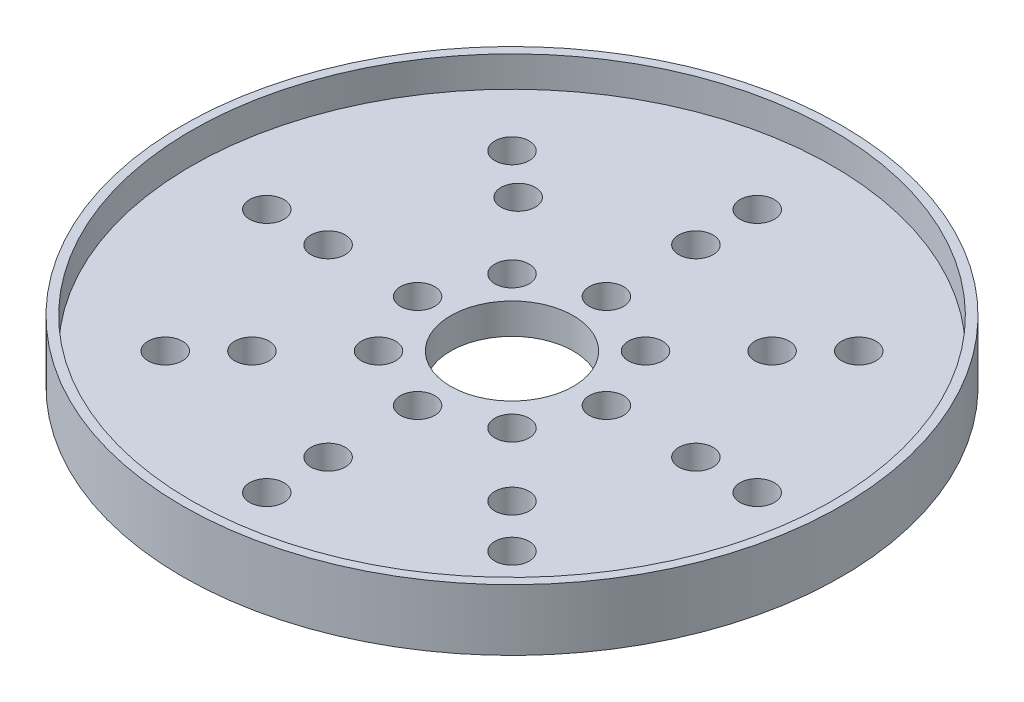
ISO-10303-21;
HEADER;
FILE_DESCRIPTION(('STEP AP214'),'2;1');
FILE_NAME('part.step','',(''),(''),'','','');
FILE_SCHEMA(('AUTOMOTIVE_DESIGN { 1 0 10303 214 1 1 1 1 }'));
ENDSEC;
DATA;
#1=APPLICATION_CONTEXT('core data for automotive mechanical design processes');
#2=APPLICATION_PROTOCOL_DEFINITION('international standard','automotive_design',2000,#1);
#3=PRODUCT_CONTEXT('',#1,'mechanical');
#4=PRODUCT('Part','Part','',(#3));
#5=PRODUCT_RELATED_PRODUCT_CATEGORY('part','',(#4));
#6=PRODUCT_DEFINITION_FORMATION('','',#4);
#7=PRODUCT_DEFINITION_CONTEXT('part definition',#1,'design');
#8=PRODUCT_DEFINITION('design','',#6,#7);
#9=PRODUCT_DEFINITION_SHAPE('','',#8);
#10=(LENGTH_UNIT() NAMED_UNIT(*) SI_UNIT(.MILLI.,.METRE.));
#11=(NAMED_UNIT(*) PLANE_ANGLE_UNIT() SI_UNIT($,.RADIAN.));
#12=(NAMED_UNIT(*) SI_UNIT($,.STERADIAN.) SOLID_ANGLE_UNIT());
#13=UNCERTAINTY_MEASURE_WITH_UNIT(LENGTH_MEASURE(1.E-05),#10,'distance_accuracy_value','');
#14=(GEOMETRIC_REPRESENTATION_CONTEXT(3) GLOBAL_UNCERTAINTY_ASSIGNED_CONTEXT((#13)) GLOBAL_UNIT_ASSIGNED_CONTEXT((#10,
#11,#12)) REPRESENTATION_CONTEXT('',''));
#15=CARTESIAN_POINT('',(0.,0.,0.));
#16=DIRECTION('',(0.,0.,1.));
#17=DIRECTION('',(1.,0.,0.));
#18=AXIS2_PLACEMENT_3D('',#15,#16,#17);
#19=CARTESIAN_POINT('',(0.,6.35,0.));
#20=DIRECTION('',(0.,-1.,0.));
#21=DIRECTION('',(0.,0.,-1.));
#22=AXIS2_PLACEMENT_3D('',#19,#20,#21);
#23=CYLINDRICAL_SURFACE('',#22,34.1376);
#24=CARTESIAN_POINT('',(0.,6.35,0.));
#25=DIRECTION('',(0.,1.,0.));
#26=DIRECTION('',(0.,0.,1.));
#27=AXIS2_PLACEMENT_3D('',#24,#25,#26);
#28=CIRCLE('',#27,34.1376);
#29=CARTESIAN_POINT('',(0.,6.35,34.1376));
#30=VERTEX_POINT('',#29);
#31=EDGE_CURVE('E10',#30,#30,#28,.T.);
#32=ORIENTED_EDGE('',*,*,#31,.F.);
#33=EDGE_LOOP('',(#32));
#34=FACE_BOUND('',#33,.T.);
#35=CARTESIAN_POINT('',(0.,0.,0.));
#36=DIRECTION('',(0.,1.,0.));
#37=DIRECTION('',(0.,0.,1.));
#38=AXIS2_PLACEMENT_3D('',#35,#36,#37);
#39=CIRCLE('',#38,34.1376);
#40=CARTESIAN_POINT('',(0.,0.,34.1376));
#41=VERTEX_POINT('',#40);
#42=EDGE_CURVE('E34',#41,#41,#39,.T.);
#43=ORIENTED_EDGE('',*,*,#42,.T.);
#44=EDGE_LOOP('',(#43));
#45=FACE_BOUND('',#44,.T.);
#46=ADVANCED_FACE('F31',(#34,#45),#23,.T.);
#47=CARTESIAN_POINT('',(0.,6.35,0.));
#48=DIRECTION('',(0.,1.,0.));
#49=DIRECTION('',(0.,0.,1.));
#50=AXIS2_PLACEMENT_3D('',#47,#48,#49);
#51=PLANE('',#50);
#52=CARTESIAN_POINT('',(0.,6.35,0.));
#53=DIRECTION('',(0.,1.,0.));
#54=DIRECTION('',(0.,0.,1.));
#55=AXIS2_PLACEMENT_3D('',#52,#53,#54);
#56=CIRCLE('',#55,33.2105);
#57=CARTESIAN_POINT('',(0.,6.35,33.2105));
#58=VERTEX_POINT('',#57);
#59=EDGE_CURVE('E43',#58,#58,#56,.T.);
#60=ORIENTED_EDGE('',*,*,#59,.F.);
#61=EDGE_LOOP('',(#60));
#62=FACE_BOUND('',#61,.T.);
#63=ORIENTED_EDGE('',*,*,#31,.T.);
#64=EDGE_LOOP('',(#63));
#65=FACE_BOUND('',#64,.T.);
#66=ADVANCED_FACE('F270',(#62,#65),#51,.T.);
#67=CARTESIAN_POINT('',(0.,0.,0.));
#68=DIRECTION('',(0.,1.,0.));
#69=DIRECTION('',(0.,0.,1.));
#70=AXIS2_PLACEMENT_3D('',#67,#68,#69);
#71=PLANE('',#70);
#72=CARTESIAN_POINT('',(6.91479721322325,0.,6.91479721322325));
#73=DIRECTION('',(0.,1.,0.));
#74=DIRECTION('',(0.,0.,1.));
#75=AXIS2_PLACEMENT_3D('',#72,#73,#74);
#76=CIRCLE('',#75,1.778);
#77=CARTESIAN_POINT('',(6.91479721322325,0.,8.69279721322325));
#78=VERTEX_POINT('',#77);
#79=EDGE_CURVE('E190',#78,#78,#76,.T.);
#80=ORIENTED_EDGE('',*,*,#79,.T.);
#81=EDGE_LOOP('',(#80));
#82=FACE_BOUND('',#81,.T.);
#83=CARTESIAN_POINT('',(0.,0.,9.779));
#84=DIRECTION('',(0.,1.,0.));
#85=DIRECTION('',(0.,0.,1.));
#86=AXIS2_PLACEMENT_3D('',#83,#84,#85);
#87=CIRCLE('',#86,1.778);
#88=CARTESIAN_POINT('',(0.,0.,11.557));
#89=VERTEX_POINT('',#88);
#90=EDGE_CURVE('E184',#89,#89,#87,.T.);
#91=ORIENTED_EDGE('',*,*,#90,.T.);
#92=EDGE_LOOP('',(#91));
#93=FACE_BOUND('',#92,.T.);
#94=CARTESIAN_POINT('',(-6.91479721322325,0.,6.91479721322325));
#95=DIRECTION('',(0.,1.,0.));
#96=DIRECTION('',(0.,0.,1.));
#97=AXIS2_PLACEMENT_3D('',#94,#95,#96);
#98=CIRCLE('',#97,1.778);
#99=CARTESIAN_POINT('',(-6.91479721322325,0.,8.69279721322325));
#100=VERTEX_POINT('',#99);
#101=EDGE_CURVE('E178',#100,#100,#98,.T.);
#102=ORIENTED_EDGE('',*,*,#101,.T.);
#103=EDGE_LOOP('',(#102));
#104=FACE_BOUND('',#103,.T.);
#105=CARTESIAN_POINT('',(-9.779,0.,0.));
#106=DIRECTION('',(0.,1.,0.));
#107=DIRECTION('',(0.,0.,1.));
#108=AXIS2_PLACEMENT_3D('',#105,#106,#107);
#109=CIRCLE('',#108,1.778);
#110=CARTESIAN_POINT('',(-9.779,0.,1.778));
#111=VERTEX_POINT('',#110);
#112=EDGE_CURVE('E172',#111,#111,#109,.T.);
#113=ORIENTED_EDGE('',*,*,#112,.T.);
#114=EDGE_LOOP('',(#113));
#115=FACE_BOUND('',#114,.T.);
#116=CARTESIAN_POINT('',(-6.91479721322325,0.,-6.91479721322325));
#117=DIRECTION('',(0.,1.,0.));
#118=DIRECTION('',(0.,0.,1.));
#119=AXIS2_PLACEMENT_3D('',#116,#117,#118);
#120=CIRCLE('',#119,1.778);
#121=CARTESIAN_POINT('',(-6.91479721322325,0.,-5.13679721322325));
#122=VERTEX_POINT('',#121);
#123=EDGE_CURVE('E166',#122,#122,#120,.T.);
#124=ORIENTED_EDGE('',*,*,#123,.T.);
#125=EDGE_LOOP('',(#124));
#126=FACE_BOUND('',#125,.T.);
#127=CARTESIAN_POINT('',(0.,0.,-9.779));
#128=DIRECTION('',(0.,1.,0.));
#129=DIRECTION('',(0.,0.,1.));
#130=AXIS2_PLACEMENT_3D('',#127,#128,#129);
#131=CIRCLE('',#130,1.778);
#132=CARTESIAN_POINT('',(0.,0.,-8.001));
#133=VERTEX_POINT('',#132);
#134=EDGE_CURVE('E160',#133,#133,#131,.T.);
#135=ORIENTED_EDGE('',*,*,#134,.T.);
#136=EDGE_LOOP('',(#135));
#137=FACE_BOUND('',#136,.T.);
#138=CARTESIAN_POINT('',(6.91479721322325,0.,-6.91479721322325));
#139=DIRECTION('',(0.,1.,0.));
#140=DIRECTION('',(0.,0.,1.));
#141=AXIS2_PLACEMENT_3D('',#138,#139,#140);
#142=CIRCLE('',#141,1.778);
#143=CARTESIAN_POINT('',(6.91479721322325,0.,-5.13679721322325));
#144=VERTEX_POINT('',#143);
#145=EDGE_CURVE('E154',#144,#144,#142,.T.);
#146=ORIENTED_EDGE('',*,*,#145,.T.);
#147=EDGE_LOOP('',(#146));
#148=FACE_BOUND('',#147,.T.);
#149=CARTESIAN_POINT('',(9.779,0.,0.));
#150=DIRECTION('',(0.,1.,0.));
#151=DIRECTION('',(0.,0.,1.));
#152=AXIS2_PLACEMENT_3D('',#149,#150,#151);
#153=CIRCLE('',#152,1.778);
#154=CARTESIAN_POINT('',(9.779,0.,1.778));
#155=VERTEX_POINT('',#154);
#156=EDGE_CURVE('E148',#155,#155,#153,.T.);
#157=ORIENTED_EDGE('',*,*,#156,.T.);
#158=EDGE_LOOP('',(#157));
#159=FACE_BOUND('',#158,.T.);
#160=CARTESIAN_POINT('',(13.4703841816037,0.,-13.4703841816037));
#161=DIRECTION('',(0.,1.,0.));
#162=DIRECTION('',(0.,0.,1.));
#163=AXIS2_PLACEMENT_3D('',#160,#161,#162);
#164=CIRCLE('',#163,1.778);
#165=CARTESIAN_POINT('',(13.4703841816037,0.,-11.6923841816037));
#166=VERTEX_POINT('',#165);
#167=EDGE_CURVE('E142',#166,#166,#164,.T.);
#168=ORIENTED_EDGE('',*,*,#167,.T.);
#169=EDGE_LOOP('',(#168));
#170=FACE_BOUND('',#169,.T.);
#171=CARTESIAN_POINT('',(19.05,0.,0.));
#172=DIRECTION('',(0.,1.,0.));
#173=DIRECTION('',(0.,0.,1.));
#174=AXIS2_PLACEMENT_3D('',#171,#172,#173);
#175=CIRCLE('',#174,1.778);
#176=CARTESIAN_POINT('',(19.05,0.,1.778));
#177=VERTEX_POINT('',#176);
#178=EDGE_CURVE('E136',#177,#177,#175,.T.);
#179=ORIENTED_EDGE('',*,*,#178,.T.);
#180=EDGE_LOOP('',(#179));
#181=FACE_BOUND('',#180,.T.);
#182=CARTESIAN_POINT('',(13.4703841816037,0.,13.4703841816037));
#183=DIRECTION('',(0.,1.,0.));
#184=DIRECTION('',(0.,0.,1.));
#185=AXIS2_PLACEMENT_3D('',#182,#183,#184);
#186=CIRCLE('',#185,1.778);
#187=CARTESIAN_POINT('',(13.4703841816037,0.,15.2483841816037));
#188=VERTEX_POINT('',#187);
#189=EDGE_CURVE('E130',#188,#188,#186,.T.);
#190=ORIENTED_EDGE('',*,*,#189,.T.);
#191=EDGE_LOOP('',(#190));
#192=FACE_BOUND('',#191,.T.);
#193=CARTESIAN_POINT('',(0.,0.,19.05));
#194=DIRECTION('',(0.,1.,0.));
#195=DIRECTION('',(0.,0.,1.));
#196=AXIS2_PLACEMENT_3D('',#193,#194,#195);
#197=CIRCLE('',#196,1.778);
#198=CARTESIAN_POINT('',(0.,0.,20.828));
#199=VERTEX_POINT('',#198);
#200=EDGE_CURVE('E124',#199,#199,#197,.T.);
#201=ORIENTED_EDGE('',*,*,#200,.T.);
#202=EDGE_LOOP('',(#201));
#203=FACE_BOUND('',#202,.T.);
#204=CARTESIAN_POINT('',(-13.4703841816037,0.,13.4703841816037));
#205=DIRECTION('',(0.,1.,0.));
#206=DIRECTION('',(0.,0.,1.));
#207=AXIS2_PLACEMENT_3D('',#204,#205,#206);
#208=CIRCLE('',#207,1.778);
#209=CARTESIAN_POINT('',(-13.4703841816037,0.,15.2483841816037));
#210=VERTEX_POINT('',#209);
#211=EDGE_CURVE('E118',#210,#210,#208,.T.);
#212=ORIENTED_EDGE('',*,*,#211,.T.);
#213=EDGE_LOOP('',(#212));
#214=FACE_BOUND('',#213,.T.);
#215=CARTESIAN_POINT('',(-19.05,0.,0.));
#216=DIRECTION('',(0.,1.,0.));
#217=DIRECTION('',(0.,0.,1.));
#218=AXIS2_PLACEMENT_3D('',#215,#216,#217);
#219=CIRCLE('',#218,1.778);
#220=CARTESIAN_POINT('',(-19.05,0.,1.778));
#221=VERTEX_POINT('',#220);
#222=EDGE_CURVE('E112',#221,#221,#219,.T.);
#223=ORIENTED_EDGE('',*,*,#222,.T.);
#224=EDGE_LOOP('',(#223));
#225=FACE_BOUND('',#224,.T.);
#226=CARTESIAN_POINT('',(-13.4703841816037,0.,-14.1089661095624));
#227=DIRECTION('',(0.,1.,0.));
#228=DIRECTION('',(0.,0.,1.));
#229=AXIS2_PLACEMENT_3D('',#226,#227,#228);
#230=CIRCLE('',#229,1.778);
#231=CARTESIAN_POINT('',(-13.4703841816037,0.,-12.3309661095624));
#232=VERTEX_POINT('',#231);
#233=EDGE_CURVE('E106',#232,#232,#230,.T.);
#234=ORIENTED_EDGE('',*,*,#233,.T.);
#235=EDGE_LOOP('',(#234));
#236=FACE_BOUND('',#235,.T.);
#237=CARTESIAN_POINT('',(0.,0.,-19.05));
#238=DIRECTION('',(0.,1.,0.));
#239=DIRECTION('',(0.,0.,1.));
#240=AXIS2_PLACEMENT_3D('',#237,#238,#239);
#241=CIRCLE('',#240,1.778);
#242=CARTESIAN_POINT('',(0.,0.,-17.272));
#243=VERTEX_POINT('',#242);
#244=EDGE_CURVE('E100',#243,#243,#241,.T.);
#245=ORIENTED_EDGE('',*,*,#244,.T.);
#246=EDGE_LOOP('',(#245));
#247=FACE_BOUND('',#246,.T.);
#248=CARTESIAN_POINT('',(17.9605122421383,0.,17.9605122421383));
#249=DIRECTION('',(0.,1.,0.));
#250=DIRECTION('',(0.,0.,1.));
#251=AXIS2_PLACEMENT_3D('',#248,#249,#250);
#252=CIRCLE('',#251,1.778);
#253=CARTESIAN_POINT('',(17.9605122421383,0.,19.7385122421383));
#254=VERTEX_POINT('',#253);
#255=EDGE_CURVE('E94',#254,#254,#252,.T.);
#256=ORIENTED_EDGE('',*,*,#255,.T.);
#257=EDGE_LOOP('',(#256));
#258=FACE_BOUND('',#257,.T.);
#259=CARTESIAN_POINT('',(0.,0.,25.4));
#260=DIRECTION('',(0.,1.,0.));
#261=DIRECTION('',(0.,0.,1.));
#262=AXIS2_PLACEMENT_3D('',#259,#260,#261);
#263=CIRCLE('',#262,1.778);
#264=CARTESIAN_POINT('',(0.,0.,27.178));
#265=VERTEX_POINT('',#264);
#266=EDGE_CURVE('E88',#265,#265,#263,.T.);
#267=ORIENTED_EDGE('',*,*,#266,.T.);
#268=EDGE_LOOP('',(#267));
#269=FACE_BOUND('',#268,.T.);
#270=CARTESIAN_POINT('',(-17.9605122421383,0.,17.9605122421383));
#271=DIRECTION('',(0.,1.,0.));
#272=DIRECTION('',(0.,0.,1.));
#273=AXIS2_PLACEMENT_3D('',#270,#271,#272);
#274=CIRCLE('',#273,1.778);
#275=CARTESIAN_POINT('',(-17.9605122421383,0.,19.7385122421383));
#276=VERTEX_POINT('',#275);
#277=EDGE_CURVE('E82',#276,#276,#274,.T.);
#278=ORIENTED_EDGE('',*,*,#277,.T.);
#279=EDGE_LOOP('',(#278));
#280=FACE_BOUND('',#279,.T.);
#281=CARTESIAN_POINT('',(-25.4,0.,0.));
#282=DIRECTION('',(0.,1.,0.));
#283=DIRECTION('',(0.,0.,1.));
#284=AXIS2_PLACEMENT_3D('',#281,#282,#283);
#285=CIRCLE('',#284,1.778);
#286=CARTESIAN_POINT('',(-25.4,0.,1.77800000000001));
#287=VERTEX_POINT('',#286);
#288=EDGE_CURVE('E76',#287,#287,#285,.T.);
#289=ORIENTED_EDGE('',*,*,#288,.T.);
#290=EDGE_LOOP('',(#289));
#291=FACE_BOUND('',#290,.T.);
#292=CARTESIAN_POINT('',(-17.9605122421383,0.,-17.9605122421383));
#293=DIRECTION('',(0.,1.,0.));
#294=DIRECTION('',(0.,0.,1.));
#295=AXIS2_PLACEMENT_3D('',#292,#293,#294);
#296=CIRCLE('',#295,1.778);
#297=CARTESIAN_POINT('',(-17.9605122421383,0.,-16.1825122421383));
#298=VERTEX_POINT('',#297);
#299=EDGE_CURVE('E70',#298,#298,#296,.T.);
#300=ORIENTED_EDGE('',*,*,#299,.T.);
#301=EDGE_LOOP('',(#300));
#302=FACE_BOUND('',#301,.T.);
#303=CARTESIAN_POINT('',(0.,0.,-25.4));
#304=DIRECTION('',(0.,1.,0.));
#305=DIRECTION('',(0.,0.,1.));
#306=AXIS2_PLACEMENT_3D('',#303,#304,#305);
#307=CIRCLE('',#306,1.778);
#308=CARTESIAN_POINT('',(0.,0.,-23.622));
#309=VERTEX_POINT('',#308);
#310=EDGE_CURVE('E64',#309,#309,#307,.T.);
#311=ORIENTED_EDGE('',*,*,#310,.T.);
#312=EDGE_LOOP('',(#311));
#313=FACE_BOUND('',#312,.T.);
#314=CARTESIAN_POINT('',(17.9605122421383,0.,-17.9605122421383));
#315=DIRECTION('',(0.,1.,0.));
#316=DIRECTION('',(0.,0.,1.));
#317=AXIS2_PLACEMENT_3D('',#314,#315,#316);
#318=CIRCLE('',#317,1.778);
#319=CARTESIAN_POINT('',(17.9605122421383,0.,-16.1825122421383));
#320=VERTEX_POINT('',#319);
#321=EDGE_CURVE('E58',#320,#320,#318,.T.);
#322=ORIENTED_EDGE('',*,*,#321,.T.);
#323=EDGE_LOOP('',(#322));
#324=FACE_BOUND('',#323,.T.);
#325=CARTESIAN_POINT('',(25.4,0.,0.));
#326=DIRECTION('',(0.,1.,0.));
#327=DIRECTION('',(0.,0.,1.));
#328=AXIS2_PLACEMENT_3D('',#325,#326,#327);
#329=CIRCLE('',#328,1.778);
#330=CARTESIAN_POINT('',(25.4,0.,1.778));
#331=VERTEX_POINT('',#330);
#332=EDGE_CURVE('E52',#331,#331,#329,.T.);
#333=ORIENTED_EDGE('',*,*,#332,.T.);
#334=EDGE_LOOP('',(#333));
#335=FACE_BOUND('',#334,.T.);
#336=CARTESIAN_POINT('',(0.,0.,0.));
#337=DIRECTION('',(0.,1.,0.));
#338=DIRECTION('',(0.,0.,1.));
#339=AXIS2_PLACEMENT_3D('',#336,#337,#338);
#340=CIRCLE('',#339,6.35);
#341=CARTESIAN_POINT('',(0.,0.,6.35));
#342=VERTEX_POINT('',#341);
#343=EDGE_CURVE('E46',#342,#342,#340,.T.);
#344=ORIENTED_EDGE('',*,*,#343,.T.);
#345=EDGE_LOOP('',(#344));
#346=FACE_BOUND('',#345,.T.);
#347=ORIENTED_EDGE('',*,*,#42,.F.);
#348=EDGE_LOOP('',(#347));
#349=FACE_BOUND('',#348,.T.);
#350=ADVANCED_FACE('F199',(#82,#93,#104,#115,#126,#137,#148,#159,#170,#181,#192,#203,#214,#225,
#236,#247,#258,#269,#280,#291,#302,#313,#324,#335,#346,#349),#71,.F.);
#351=CARTESIAN_POINT('',(0.,3.175,0.));
#352=DIRECTION('',(0.,1.,0.));
#353=DIRECTION('',(0.,0.,1.));
#354=AXIS2_PLACEMENT_3D('',#351,#352,#353);
#355=CYLINDRICAL_SURFACE('',#354,33.2105);
#356=CARTESIAN_POINT('',(0.,3.175,0.));
#357=DIRECTION('',(0.,1.,0.));
#358=DIRECTION('',(0.,0.,1.));
#359=AXIS2_PLACEMENT_3D('',#356,#357,#358);
#360=CIRCLE('',#359,33.2105);
#361=CARTESIAN_POINT('',(0.,3.175,33.2105));
#362=VERTEX_POINT('',#361);
#363=EDGE_CURVE('E41',#362,#362,#360,.T.);
#364=ORIENTED_EDGE('',*,*,#363,.F.);
#365=EDGE_LOOP('',(#364));
#366=FACE_BOUND('',#365,.T.);
#367=ORIENTED_EDGE('',*,*,#59,.T.);
#368=EDGE_LOOP('',(#367));
#369=FACE_BOUND('',#368,.T.);
#370=ADVANCED_FACE('F213',(#366,#369),#355,.F.);
#371=CARTESIAN_POINT('',(0.,3.175,0.));
#372=DIRECTION('',(0.,1.,0.));
#373=DIRECTION('',(0.,0.,1.));
#374=AXIS2_PLACEMENT_3D('',#371,#372,#373);
#375=PLANE('',#374);
#376=CARTESIAN_POINT('',(6.91479721322325,3.175,6.91479721322325));
#377=DIRECTION('',(0.,1.,0.));
#378=DIRECTION('',(0.,0.,1.));
#379=AXIS2_PLACEMENT_3D('',#376,#377,#378);
#380=CIRCLE('',#379,1.778);
#381=CARTESIAN_POINT('',(6.91479721322325,3.175,8.69279721322325));
#382=VERTEX_POINT('',#381);
#383=EDGE_CURVE('E193',#382,#382,#380,.T.);
#384=ORIENTED_EDGE('',*,*,#383,.F.);
#385=EDGE_LOOP('',(#384));
#386=FACE_BOUND('',#385,.T.);
#387=CARTESIAN_POINT('',(0.,3.175,9.779));
#388=DIRECTION('',(0.,1.,0.));
#389=DIRECTION('',(0.,0.,1.));
#390=AXIS2_PLACEMENT_3D('',#387,#388,#389);
#391=CIRCLE('',#390,1.778);
#392=CARTESIAN_POINT('',(0.,3.175,11.557));
#393=VERTEX_POINT('',#392);
#394=EDGE_CURVE('E187',#393,#393,#391,.T.);
#395=ORIENTED_EDGE('',*,*,#394,.F.);
#396=EDGE_LOOP('',(#395));
#397=FACE_BOUND('',#396,.T.);
#398=CARTESIAN_POINT('',(-6.91479721322325,3.175,6.91479721322325));
#399=DIRECTION('',(0.,1.,0.));
#400=DIRECTION('',(0.,0.,1.));
#401=AXIS2_PLACEMENT_3D('',#398,#399,#400);
#402=CIRCLE('',#401,1.778);
#403=CARTESIAN_POINT('',(-6.91479721322325,3.175,8.69279721322325));
#404=VERTEX_POINT('',#403);
#405=EDGE_CURVE('E181',#404,#404,#402,.T.);
#406=ORIENTED_EDGE('',*,*,#405,.F.);
#407=EDGE_LOOP('',(#406));
#408=FACE_BOUND('',#407,.T.);
#409=CARTESIAN_POINT('',(-9.779,3.175,0.));
#410=DIRECTION('',(0.,1.,0.));
#411=DIRECTION('',(0.,0.,1.));
#412=AXIS2_PLACEMENT_3D('',#409,#410,#411);
#413=CIRCLE('',#412,1.778);
#414=CARTESIAN_POINT('',(-9.779,3.175,1.778));
#415=VERTEX_POINT('',#414);
#416=EDGE_CURVE('E175',#415,#415,#413,.T.);
#417=ORIENTED_EDGE('',*,*,#416,.F.);
#418=EDGE_LOOP('',(#417));
#419=FACE_BOUND('',#418,.T.);
#420=CARTESIAN_POINT('',(-6.91479721322325,3.175,-6.91479721322325));
#421=DIRECTION('',(0.,1.,0.));
#422=DIRECTION('',(0.,0.,1.));
#423=AXIS2_PLACEMENT_3D('',#420,#421,#422);
#424=CIRCLE('',#423,1.778);
#425=CARTESIAN_POINT('',(-6.91479721322325,3.175,-5.13679721322325));
#426=VERTEX_POINT('',#425);
#427=EDGE_CURVE('E169',#426,#426,#424,.T.);
#428=ORIENTED_EDGE('',*,*,#427,.F.);
#429=EDGE_LOOP('',(#428));
#430=FACE_BOUND('',#429,.T.);
#431=CARTESIAN_POINT('',(0.,3.175,-9.779));
#432=DIRECTION('',(0.,1.,0.));
#433=DIRECTION('',(0.,0.,1.));
#434=AXIS2_PLACEMENT_3D('',#431,#432,#433);
#435=CIRCLE('',#434,1.778);
#436=CARTESIAN_POINT('',(0.,3.175,-8.001));
#437=VERTEX_POINT('',#436);
#438=EDGE_CURVE('E163',#437,#437,#435,.T.);
#439=ORIENTED_EDGE('',*,*,#438,.F.);
#440=EDGE_LOOP('',(#439));
#441=FACE_BOUND('',#440,.T.);
#442=CARTESIAN_POINT('',(6.91479721322325,3.175,-6.91479721322325));
#443=DIRECTION('',(0.,1.,0.));
#444=DIRECTION('',(0.,0.,1.));
#445=AXIS2_PLACEMENT_3D('',#442,#443,#444);
#446=CIRCLE('',#445,1.778);
#447=CARTESIAN_POINT('',(6.91479721322325,3.175,-5.13679721322325));
#448=VERTEX_POINT('',#447);
#449=EDGE_CURVE('E157',#448,#448,#446,.T.);
#450=ORIENTED_EDGE('',*,*,#449,.F.);
#451=EDGE_LOOP('',(#450));
#452=FACE_BOUND('',#451,.T.);
#453=CARTESIAN_POINT('',(9.779,3.175,0.));
#454=DIRECTION('',(0.,1.,0.));
#455=DIRECTION('',(0.,0.,1.));
#456=AXIS2_PLACEMENT_3D('',#453,#454,#455);
#457=CIRCLE('',#456,1.778);
#458=CARTESIAN_POINT('',(9.779,3.175,1.778));
#459=VERTEX_POINT('',#458);
#460=EDGE_CURVE('E151',#459,#459,#457,.T.);
#461=ORIENTED_EDGE('',*,*,#460,.F.);
#462=EDGE_LOOP('',(#461));
#463=FACE_BOUND('',#462,.T.);
#464=CARTESIAN_POINT('',(13.4703841816037,3.175,-13.4703841816037));
#465=DIRECTION('',(0.,1.,0.));
#466=DIRECTION('',(0.,0.,1.));
#467=AXIS2_PLACEMENT_3D('',#464,#465,#466);
#468=CIRCLE('',#467,1.778);
#469=CARTESIAN_POINT('',(13.4703841816037,3.175,-11.6923841816037));
#470=VERTEX_POINT('',#469);
#471=EDGE_CURVE('E145',#470,#470,#468,.T.);
#472=ORIENTED_EDGE('',*,*,#471,.F.);
#473=EDGE_LOOP('',(#472));
#474=FACE_BOUND('',#473,.T.);
#475=CARTESIAN_POINT('',(19.05,3.175,0.));
#476=DIRECTION('',(0.,1.,0.));
#477=DIRECTION('',(0.,0.,1.));
#478=AXIS2_PLACEMENT_3D('',#475,#476,#477);
#479=CIRCLE('',#478,1.778);
#480=CARTESIAN_POINT('',(19.05,3.175,1.778));
#481=VERTEX_POINT('',#480);
#482=EDGE_CURVE('E139',#481,#481,#479,.T.);
#483=ORIENTED_EDGE('',*,*,#482,.F.);
#484=EDGE_LOOP('',(#483));
#485=FACE_BOUND('',#484,.T.);
#486=CARTESIAN_POINT('',(13.4703841816037,3.175,13.4703841816037));
#487=DIRECTION('',(0.,1.,0.));
#488=DIRECTION('',(0.,0.,1.));
#489=AXIS2_PLACEMENT_3D('',#486,#487,#488);
#490=CIRCLE('',#489,1.778);
#491=CARTESIAN_POINT('',(13.4703841816037,3.175,15.2483841816037));
#492=VERTEX_POINT('',#491);
#493=EDGE_CURVE('E133',#492,#492,#490,.T.);
#494=ORIENTED_EDGE('',*,*,#493,.F.);
#495=EDGE_LOOP('',(#494));
#496=FACE_BOUND('',#495,.T.);
#497=CARTESIAN_POINT('',(0.,3.175,19.05));
#498=DIRECTION('',(0.,1.,0.));
#499=DIRECTION('',(0.,0.,1.));
#500=AXIS2_PLACEMENT_3D('',#497,#498,#499);
#501=CIRCLE('',#500,1.778);
#502=CARTESIAN_POINT('',(0.,3.175,20.828));
#503=VERTEX_POINT('',#502);
#504=EDGE_CURVE('E127',#503,#503,#501,.T.);
#505=ORIENTED_EDGE('',*,*,#504,.F.);
#506=EDGE_LOOP('',(#505));
#507=FACE_BOUND('',#506,.T.);
#508=CARTESIAN_POINT('',(-13.4703841816037,3.175,13.4703841816037));
#509=DIRECTION('',(0.,1.,0.));
#510=DIRECTION('',(0.,0.,1.));
#511=AXIS2_PLACEMENT_3D('',#508,#509,#510);
#512=CIRCLE('',#511,1.778);
#513=CARTESIAN_POINT('',(-13.4703841816037,3.175,15.2483841816037));
#514=VERTEX_POINT('',#513);
#515=EDGE_CURVE('E121',#514,#514,#512,.T.);
#516=ORIENTED_EDGE('',*,*,#515,.F.);
#517=EDGE_LOOP('',(#516));
#518=FACE_BOUND('',#517,.T.);
#519=CARTESIAN_POINT('',(-19.05,3.175,0.));
#520=DIRECTION('',(0.,1.,0.));
#521=DIRECTION('',(0.,0.,1.));
#522=AXIS2_PLACEMENT_3D('',#519,#520,#521);
#523=CIRCLE('',#522,1.778);
#524=CARTESIAN_POINT('',(-19.05,3.175,1.778));
#525=VERTEX_POINT('',#524);
#526=EDGE_CURVE('E115',#525,#525,#523,.T.);
#527=ORIENTED_EDGE('',*,*,#526,.F.);
#528=EDGE_LOOP('',(#527));
#529=FACE_BOUND('',#528,.T.);
#530=CARTESIAN_POINT('',(-13.4703841816037,3.175,-14.1089661095624));
#531=DIRECTION('',(0.,1.,0.));
#532=DIRECTION('',(0.,0.,1.));
#533=AXIS2_PLACEMENT_3D('',#530,#531,#532);
#534=CIRCLE('',#533,1.778);
#535=CARTESIAN_POINT('',(-13.4703841816037,3.175,-12.3309661095624));
#536=VERTEX_POINT('',#535);
#537=EDGE_CURVE('E109',#536,#536,#534,.T.);
#538=ORIENTED_EDGE('',*,*,#537,.F.);
#539=EDGE_LOOP('',(#538));
#540=FACE_BOUND('',#539,.T.);
#541=CARTESIAN_POINT('',(0.,3.175,-19.05));
#542=DIRECTION('',(0.,1.,0.));
#543=DIRECTION('',(0.,0.,1.));
#544=AXIS2_PLACEMENT_3D('',#541,#542,#543);
#545=CIRCLE('',#544,1.778);
#546=CARTESIAN_POINT('',(0.,3.175,-17.272));
#547=VERTEX_POINT('',#546);
#548=EDGE_CURVE('E103',#547,#547,#545,.T.);
#549=ORIENTED_EDGE('',*,*,#548,.F.);
#550=EDGE_LOOP('',(#549));
#551=FACE_BOUND('',#550,.T.);
#552=CARTESIAN_POINT('',(17.9605122421383,3.175,17.9605122421383));
#553=DIRECTION('',(0.,1.,0.));
#554=DIRECTION('',(0.,0.,1.));
#555=AXIS2_PLACEMENT_3D('',#552,#553,#554);
#556=CIRCLE('',#555,1.778);
#557=CARTESIAN_POINT('',(17.9605122421383,3.175,19.7385122421383));
#558=VERTEX_POINT('',#557);
#559=EDGE_CURVE('E97',#558,#558,#556,.T.);
#560=ORIENTED_EDGE('',*,*,#559,.F.);
#561=EDGE_LOOP('',(#560));
#562=FACE_BOUND('',#561,.T.);
#563=CARTESIAN_POINT('',(0.,3.175,25.4));
#564=DIRECTION('',(0.,1.,0.));
#565=DIRECTION('',(0.,0.,1.));
#566=AXIS2_PLACEMENT_3D('',#563,#564,#565);
#567=CIRCLE('',#566,1.778);
#568=CARTESIAN_POINT('',(0.,3.175,27.178));
#569=VERTEX_POINT('',#568);
#570=EDGE_CURVE('E91',#569,#569,#567,.T.);
#571=ORIENTED_EDGE('',*,*,#570,.F.);
#572=EDGE_LOOP('',(#571));
#573=FACE_BOUND('',#572,.T.);
#574=CARTESIAN_POINT('',(-17.9605122421383,3.175,17.9605122421383));
#575=DIRECTION('',(0.,1.,0.));
#576=DIRECTION('',(0.,0.,1.));
#577=AXIS2_PLACEMENT_3D('',#574,#575,#576);
#578=CIRCLE('',#577,1.778);
#579=CARTESIAN_POINT('',(-17.9605122421383,3.175,19.7385122421383));
#580=VERTEX_POINT('',#579);
#581=EDGE_CURVE('E85',#580,#580,#578,.T.);
#582=ORIENTED_EDGE('',*,*,#581,.F.);
#583=EDGE_LOOP('',(#582));
#584=FACE_BOUND('',#583,.T.);
#585=CARTESIAN_POINT('',(-25.4,3.175,0.));
#586=DIRECTION('',(0.,1.,0.));
#587=DIRECTION('',(0.,0.,1.));
#588=AXIS2_PLACEMENT_3D('',#585,#586,#587);
#589=CIRCLE('',#588,1.778);
#590=CARTESIAN_POINT('',(-25.4,3.175,1.77800000000001));
#591=VERTEX_POINT('',#590);
#592=EDGE_CURVE('E79',#591,#591,#589,.T.);
#593=ORIENTED_EDGE('',*,*,#592,.F.);
#594=EDGE_LOOP('',(#593));
#595=FACE_BOUND('',#594,.T.);
#596=CARTESIAN_POINT('',(-17.9605122421383,3.175,-17.9605122421383));
#597=DIRECTION('',(0.,1.,0.));
#598=DIRECTION('',(0.,0.,1.));
#599=AXIS2_PLACEMENT_3D('',#596,#597,#598);
#600=CIRCLE('',#599,1.778);
#601=CARTESIAN_POINT('',(-17.9605122421383,3.175,-16.1825122421383));
#602=VERTEX_POINT('',#601);
#603=EDGE_CURVE('E73',#602,#602,#600,.T.);
#604=ORIENTED_EDGE('',*,*,#603,.F.);
#605=EDGE_LOOP('',(#604));
#606=FACE_BOUND('',#605,.T.);
#607=CARTESIAN_POINT('',(0.,3.175,-25.4));
#608=DIRECTION('',(0.,1.,0.));
#609=DIRECTION('',(0.,0.,1.));
#610=AXIS2_PLACEMENT_3D('',#607,#608,#609);
#611=CIRCLE('',#610,1.778);
#612=CARTESIAN_POINT('',(0.,3.175,-23.622));
#613=VERTEX_POINT('',#612);
#614=EDGE_CURVE('E67',#613,#613,#611,.T.);
#615=ORIENTED_EDGE('',*,*,#614,.F.);
#616=EDGE_LOOP('',(#615));
#617=FACE_BOUND('',#616,.T.);
#618=CARTESIAN_POINT('',(17.9605122421383,3.175,-17.9605122421383));
#619=DIRECTION('',(0.,1.,0.));
#620=DIRECTION('',(0.,0.,1.));
#621=AXIS2_PLACEMENT_3D('',#618,#619,#620);
#622=CIRCLE('',#621,1.778);
#623=CARTESIAN_POINT('',(17.9605122421383,3.175,-16.1825122421383));
#624=VERTEX_POINT('',#623);
#625=EDGE_CURVE('E61',#624,#624,#622,.T.);
#626=ORIENTED_EDGE('',*,*,#625,.F.);
#627=EDGE_LOOP('',(#626));
#628=FACE_BOUND('',#627,.T.);
#629=CARTESIAN_POINT('',(25.4,3.175,0.));
#630=DIRECTION('',(0.,1.,0.));
#631=DIRECTION('',(0.,0.,1.));
#632=AXIS2_PLACEMENT_3D('',#629,#630,#631);
#633=CIRCLE('',#632,1.778);
#634=CARTESIAN_POINT('',(25.4,3.175,1.778));
#635=VERTEX_POINT('',#634);
#636=EDGE_CURVE('E55',#635,#635,#633,.T.);
#637=ORIENTED_EDGE('',*,*,#636,.F.);
#638=EDGE_LOOP('',(#637));
#639=FACE_BOUND('',#638,.T.);
#640=CARTESIAN_POINT('',(0.,3.175,0.));
#641=DIRECTION('',(0.,1.,0.));
#642=DIRECTION('',(0.,0.,1.));
#643=AXIS2_PLACEMENT_3D('',#640,#641,#642);
#644=CIRCLE('',#643,6.35);
#645=CARTESIAN_POINT('',(0.,3.175,6.35));
#646=VERTEX_POINT('',#645);
#647=EDGE_CURVE('E49',#646,#646,#644,.T.);
#648=ORIENTED_EDGE('',*,*,#647,.F.);
#649=EDGE_LOOP('',(#648));
#650=FACE_BOUND('',#649,.T.);
#651=ORIENTED_EDGE('',*,*,#363,.T.);
#652=EDGE_LOOP('',(#651));
#653=FACE_BOUND('',#652,.T.);
#654=ADVANCED_FACE('F209',(#386,#397,#408,#419,#430,#441,#452,#463,#474,#485,#496,#507,#518,
#529,#540,#551,#562,#573,#584,#595,#606,#617,#628,#639,#650,#653),#375,.T.);
#655=CARTESIAN_POINT('',(0.,0.,0.));
#656=DIRECTION('',(0.,1.,0.));
#657=DIRECTION('',(0.,0.,1.));
#658=AXIS2_PLACEMENT_3D('',#655,#656,#657);
#659=CYLINDRICAL_SURFACE('',#658,6.35);
#660=ORIENTED_EDGE('',*,*,#343,.F.);
#661=EDGE_LOOP('',(#660));
#662=FACE_BOUND('',#661,.T.);
#663=ORIENTED_EDGE('',*,*,#647,.T.);
#664=EDGE_LOOP('',(#663));
#665=FACE_BOUND('',#664,.T.);
#666=ADVANCED_FACE('F212',(#662,#665),#659,.F.);
#667=CARTESIAN_POINT('',(25.4,0.,0.));
#668=DIRECTION('',(0.,1.,0.));
#669=DIRECTION('',(0.,0.,1.));
#670=AXIS2_PLACEMENT_3D('',#667,#668,#669);
#671=CYLINDRICAL_SURFACE('',#670,1.778);
#672=ORIENTED_EDGE('',*,*,#332,.F.);
#673=EDGE_LOOP('',(#672));
#674=FACE_BOUND('',#673,.T.);
#675=ORIENTED_EDGE('',*,*,#636,.T.);
#676=EDGE_LOOP('',(#675));
#677=FACE_BOUND('',#676,.T.);
#678=ADVANCED_FACE('F281',(#674,#677),#671,.F.);
#679=CARTESIAN_POINT('',(17.9605122421383,0.,-17.9605122421383));
#680=DIRECTION('',(0.,1.,0.));
#681=DIRECTION('',(0.,0.,1.));
#682=AXIS2_PLACEMENT_3D('',#679,#680,#681);
#683=CYLINDRICAL_SURFACE('',#682,1.778);
#684=ORIENTED_EDGE('',*,*,#321,.F.);
#685=EDGE_LOOP('',(#684));
#686=FACE_BOUND('',#685,.T.);
#687=ORIENTED_EDGE('',*,*,#625,.T.);
#688=EDGE_LOOP('',(#687));
#689=FACE_BOUND('',#688,.T.);
#690=ADVANCED_FACE('F285',(#686,#689),#683,.F.);
#691=CARTESIAN_POINT('',(0.,0.,-25.4));
#692=DIRECTION('',(0.,1.,0.));
#693=DIRECTION('',(0.,0.,1.));
#694=AXIS2_PLACEMENT_3D('',#691,#692,#693);
#695=CYLINDRICAL_SURFACE('',#694,1.778);
#696=ORIENTED_EDGE('',*,*,#310,.F.);
#697=EDGE_LOOP('',(#696));
#698=FACE_BOUND('',#697,.T.);
#699=ORIENTED_EDGE('',*,*,#614,.T.);
#700=EDGE_LOOP('',(#699));
#701=FACE_BOUND('',#700,.T.);
#702=ADVANCED_FACE('F289',(#698,#701),#695,.F.);
#703=CARTESIAN_POINT('',(-17.9605122421383,0.,-17.9605122421383));
#704=DIRECTION('',(0.,1.,0.));
#705=DIRECTION('',(0.,0.,1.));
#706=AXIS2_PLACEMENT_3D('',#703,#704,#705);
#707=CYLINDRICAL_SURFACE('',#706,1.778);
#708=ORIENTED_EDGE('',*,*,#299,.F.);
#709=EDGE_LOOP('',(#708));
#710=FACE_BOUND('',#709,.T.);
#711=ORIENTED_EDGE('',*,*,#603,.T.);
#712=EDGE_LOOP('',(#711));
#713=FACE_BOUND('',#712,.T.);
#714=ADVANCED_FACE('F293',(#710,#713),#707,.F.);
#715=CARTESIAN_POINT('',(-25.4,0.,0.));
#716=DIRECTION('',(0.,1.,0.));
#717=DIRECTION('',(0.,0.,1.));
#718=AXIS2_PLACEMENT_3D('',#715,#716,#717);
#719=CYLINDRICAL_SURFACE('',#718,1.778);
#720=ORIENTED_EDGE('',*,*,#288,.F.);
#721=EDGE_LOOP('',(#720));
#722=FACE_BOUND('',#721,.T.);
#723=ORIENTED_EDGE('',*,*,#592,.T.);
#724=EDGE_LOOP('',(#723));
#725=FACE_BOUND('',#724,.T.);
#726=ADVANCED_FACE('F297',(#722,#725),#719,.F.);
#727=CARTESIAN_POINT('',(-17.9605122421383,0.,17.9605122421383));
#728=DIRECTION('',(0.,1.,0.));
#729=DIRECTION('',(0.,0.,1.));
#730=AXIS2_PLACEMENT_3D('',#727,#728,#729);
#731=CYLINDRICAL_SURFACE('',#730,1.778);
#732=ORIENTED_EDGE('',*,*,#277,.F.);
#733=EDGE_LOOP('',(#732));
#734=FACE_BOUND('',#733,.T.);
#735=ORIENTED_EDGE('',*,*,#581,.T.);
#736=EDGE_LOOP('',(#735));
#737=FACE_BOUND('',#736,.T.);
#738=ADVANCED_FACE('F301',(#734,#737),#731,.F.);
#739=CARTESIAN_POINT('',(0.,0.,25.4));
#740=DIRECTION('',(0.,1.,0.));
#741=DIRECTION('',(0.,0.,1.));
#742=AXIS2_PLACEMENT_3D('',#739,#740,#741);
#743=CYLINDRICAL_SURFACE('',#742,1.778);
#744=ORIENTED_EDGE('',*,*,#266,.F.);
#745=EDGE_LOOP('',(#744));
#746=FACE_BOUND('',#745,.T.);
#747=ORIENTED_EDGE('',*,*,#570,.T.);
#748=EDGE_LOOP('',(#747));
#749=FACE_BOUND('',#748,.T.);
#750=ADVANCED_FACE('F305',(#746,#749),#743,.F.);
#751=CARTESIAN_POINT('',(17.9605122421383,0.,17.9605122421383));
#752=DIRECTION('',(0.,1.,0.));
#753=DIRECTION('',(0.,0.,1.));
#754=AXIS2_PLACEMENT_3D('',#751,#752,#753);
#755=CYLINDRICAL_SURFACE('',#754,1.778);
#756=ORIENTED_EDGE('',*,*,#255,.F.);
#757=EDGE_LOOP('',(#756));
#758=FACE_BOUND('',#757,.T.);
#759=ORIENTED_EDGE('',*,*,#559,.T.);
#760=EDGE_LOOP('',(#759));
#761=FACE_BOUND('',#760,.T.);
#762=ADVANCED_FACE('F309',(#758,#761),#755,.F.);
#763=CARTESIAN_POINT('',(0.,0.,-19.05));
#764=DIRECTION('',(0.,1.,0.));
#765=DIRECTION('',(0.,0.,1.));
#766=AXIS2_PLACEMENT_3D('',#763,#764,#765);
#767=CYLINDRICAL_SURFACE('',#766,1.778);
#768=ORIENTED_EDGE('',*,*,#244,.F.);
#769=EDGE_LOOP('',(#768));
#770=FACE_BOUND('',#769,.T.);
#771=ORIENTED_EDGE('',*,*,#548,.T.);
#772=EDGE_LOOP('',(#771));
#773=FACE_BOUND('',#772,.T.);
#774=ADVANCED_FACE('F313',(#770,#773),#767,.F.);
#775=CARTESIAN_POINT('',(-13.4703841816037,0.,-14.1089661095624));
#776=DIRECTION('',(0.,1.,0.));
#777=DIRECTION('',(0.,0.,1.));
#778=AXIS2_PLACEMENT_3D('',#775,#776,#777);
#779=CYLINDRICAL_SURFACE('',#778,1.778);
#780=ORIENTED_EDGE('',*,*,#233,.F.);
#781=EDGE_LOOP('',(#780));
#782=FACE_BOUND('',#781,.T.);
#783=ORIENTED_EDGE('',*,*,#537,.T.);
#784=EDGE_LOOP('',(#783));
#785=FACE_BOUND('',#784,.T.);
#786=ADVANCED_FACE('F317',(#782,#785),#779,.F.);
#787=CARTESIAN_POINT('',(-19.05,0.,0.));
#788=DIRECTION('',(0.,1.,0.));
#789=DIRECTION('',(0.,0.,1.));
#790=AXIS2_PLACEMENT_3D('',#787,#788,#789);
#791=CYLINDRICAL_SURFACE('',#790,1.778);
#792=ORIENTED_EDGE('',*,*,#222,.F.);
#793=EDGE_LOOP('',(#792));
#794=FACE_BOUND('',#793,.T.);
#795=ORIENTED_EDGE('',*,*,#526,.T.);
#796=EDGE_LOOP('',(#795));
#797=FACE_BOUND('',#796,.T.);
#798=ADVANCED_FACE('F321',(#794,#797),#791,.F.);
#799=CARTESIAN_POINT('',(-13.4703841816037,0.,13.4703841816037));
#800=DIRECTION('',(0.,1.,0.));
#801=DIRECTION('',(0.,0.,1.));
#802=AXIS2_PLACEMENT_3D('',#799,#800,#801);
#803=CYLINDRICAL_SURFACE('',#802,1.778);
#804=ORIENTED_EDGE('',*,*,#211,.F.);
#805=EDGE_LOOP('',(#804));
#806=FACE_BOUND('',#805,.T.);
#807=ORIENTED_EDGE('',*,*,#515,.T.);
#808=EDGE_LOOP('',(#807));
#809=FACE_BOUND('',#808,.T.);
#810=ADVANCED_FACE('F325',(#806,#809),#803,.F.);
#811=CARTESIAN_POINT('',(0.,0.,19.05));
#812=DIRECTION('',(0.,1.,0.));
#813=DIRECTION('',(0.,0.,1.));
#814=AXIS2_PLACEMENT_3D('',#811,#812,#813);
#815=CYLINDRICAL_SURFACE('',#814,1.778);
#816=ORIENTED_EDGE('',*,*,#200,.F.);
#817=EDGE_LOOP('',(#816));
#818=FACE_BOUND('',#817,.T.);
#819=ORIENTED_EDGE('',*,*,#504,.T.);
#820=EDGE_LOOP('',(#819));
#821=FACE_BOUND('',#820,.T.);
#822=ADVANCED_FACE('F329',(#818,#821),#815,.F.);
#823=CARTESIAN_POINT('',(13.4703841816037,0.,13.4703841816037));
#824=DIRECTION('',(0.,1.,0.));
#825=DIRECTION('',(0.,0.,1.));
#826=AXIS2_PLACEMENT_3D('',#823,#824,#825);
#827=CYLINDRICAL_SURFACE('',#826,1.778);
#828=ORIENTED_EDGE('',*,*,#189,.F.);
#829=EDGE_LOOP('',(#828));
#830=FACE_BOUND('',#829,.T.);
#831=ORIENTED_EDGE('',*,*,#493,.T.);
#832=EDGE_LOOP('',(#831));
#833=FACE_BOUND('',#832,.T.);
#834=ADVANCED_FACE('F333',(#830,#833),#827,.F.);
#835=CARTESIAN_POINT('',(19.05,0.,0.));
#836=DIRECTION('',(0.,1.,0.));
#837=DIRECTION('',(0.,0.,1.));
#838=AXIS2_PLACEMENT_3D('',#835,#836,#837);
#839=CYLINDRICAL_SURFACE('',#838,1.778);
#840=ORIENTED_EDGE('',*,*,#178,.F.);
#841=EDGE_LOOP('',(#840));
#842=FACE_BOUND('',#841,.T.);
#843=ORIENTED_EDGE('',*,*,#482,.T.);
#844=EDGE_LOOP('',(#843));
#845=FACE_BOUND('',#844,.T.);
#846=ADVANCED_FACE('F337',(#842,#845),#839,.F.);
#847=CARTESIAN_POINT('',(13.4703841816037,0.,-13.4703841816037));
#848=DIRECTION('',(0.,1.,0.));
#849=DIRECTION('',(0.,0.,1.));
#850=AXIS2_PLACEMENT_3D('',#847,#848,#849);
#851=CYLINDRICAL_SURFACE('',#850,1.778);
#852=ORIENTED_EDGE('',*,*,#167,.F.);
#853=EDGE_LOOP('',(#852));
#854=FACE_BOUND('',#853,.T.);
#855=ORIENTED_EDGE('',*,*,#471,.T.);
#856=EDGE_LOOP('',(#855));
#857=FACE_BOUND('',#856,.T.);
#858=ADVANCED_FACE('F341',(#854,#857),#851,.F.);
#859=CARTESIAN_POINT('',(9.779,0.,0.));
#860=DIRECTION('',(0.,1.,0.));
#861=DIRECTION('',(0.,0.,1.));
#862=AXIS2_PLACEMENT_3D('',#859,#860,#861);
#863=CYLINDRICAL_SURFACE('',#862,1.778);
#864=ORIENTED_EDGE('',*,*,#156,.F.);
#865=EDGE_LOOP('',(#864));
#866=FACE_BOUND('',#865,.T.);
#867=ORIENTED_EDGE('',*,*,#460,.T.);
#868=EDGE_LOOP('',(#867));
#869=FACE_BOUND('',#868,.T.);
#870=ADVANCED_FACE('F345',(#866,#869),#863,.F.);
#871=CARTESIAN_POINT('',(6.91479721322325,0.,-6.91479721322325));
#872=DIRECTION('',(0.,1.,0.));
#873=DIRECTION('',(0.,0.,1.));
#874=AXIS2_PLACEMENT_3D('',#871,#872,#873);
#875=CYLINDRICAL_SURFACE('',#874,1.778);
#876=ORIENTED_EDGE('',*,*,#145,.F.);
#877=EDGE_LOOP('',(#876));
#878=FACE_BOUND('',#877,.T.);
#879=ORIENTED_EDGE('',*,*,#449,.T.);
#880=EDGE_LOOP('',(#879));
#881=FACE_BOUND('',#880,.T.);
#882=ADVANCED_FACE('F349',(#878,#881),#875,.F.);
#883=CARTESIAN_POINT('',(0.,0.,-9.779));
#884=DIRECTION('',(0.,1.,0.));
#885=DIRECTION('',(0.,0.,1.));
#886=AXIS2_PLACEMENT_3D('',#883,#884,#885);
#887=CYLINDRICAL_SURFACE('',#886,1.778);
#888=ORIENTED_EDGE('',*,*,#134,.F.);
#889=EDGE_LOOP('',(#888));
#890=FACE_BOUND('',#889,.T.);
#891=ORIENTED_EDGE('',*,*,#438,.T.);
#892=EDGE_LOOP('',(#891));
#893=FACE_BOUND('',#892,.T.);
#894=ADVANCED_FACE('F353',(#890,#893),#887,.F.);
#895=CARTESIAN_POINT('',(-6.91479721322325,0.,-6.91479721322325));
#896=DIRECTION('',(0.,1.,0.));
#897=DIRECTION('',(0.,0.,1.));
#898=AXIS2_PLACEMENT_3D('',#895,#896,#897);
#899=CYLINDRICAL_SURFACE('',#898,1.778);
#900=ORIENTED_EDGE('',*,*,#123,.F.);
#901=EDGE_LOOP('',(#900));
#902=FACE_BOUND('',#901,.T.);
#903=ORIENTED_EDGE('',*,*,#427,.T.);
#904=EDGE_LOOP('',(#903));
#905=FACE_BOUND('',#904,.T.);
#906=ADVANCED_FACE('F357',(#902,#905),#899,.F.);
#907=CARTESIAN_POINT('',(-9.779,0.,0.));
#908=DIRECTION('',(0.,1.,0.));
#909=DIRECTION('',(0.,0.,1.));
#910=AXIS2_PLACEMENT_3D('',#907,#908,#909);
#911=CYLINDRICAL_SURFACE('',#910,1.778);
#912=ORIENTED_EDGE('',*,*,#112,.F.);
#913=EDGE_LOOP('',(#912));
#914=FACE_BOUND('',#913,.T.);
#915=ORIENTED_EDGE('',*,*,#416,.T.);
#916=EDGE_LOOP('',(#915));
#917=FACE_BOUND('',#916,.T.);
#918=ADVANCED_FACE('F361',(#914,#917),#911,.F.);
#919=CARTESIAN_POINT('',(-6.91479721322325,0.,6.91479721322325));
#920=DIRECTION('',(0.,1.,0.));
#921=DIRECTION('',(0.,0.,1.));
#922=AXIS2_PLACEMENT_3D('',#919,#920,#921);
#923=CYLINDRICAL_SURFACE('',#922,1.778);
#924=ORIENTED_EDGE('',*,*,#101,.F.);
#925=EDGE_LOOP('',(#924));
#926=FACE_BOUND('',#925,.T.);
#927=ORIENTED_EDGE('',*,*,#405,.T.);
#928=EDGE_LOOP('',(#927));
#929=FACE_BOUND('',#928,.T.);
#930=ADVANCED_FACE('F365',(#926,#929),#923,.F.);
#931=CARTESIAN_POINT('',(0.,0.,9.779));
#932=DIRECTION('',(0.,1.,0.));
#933=DIRECTION('',(0.,0.,1.));
#934=AXIS2_PLACEMENT_3D('',#931,#932,#933);
#935=CYLINDRICAL_SURFACE('',#934,1.778);
#936=ORIENTED_EDGE('',*,*,#90,.F.);
#937=EDGE_LOOP('',(#936));
#938=FACE_BOUND('',#937,.T.);
#939=ORIENTED_EDGE('',*,*,#394,.T.);
#940=EDGE_LOOP('',(#939));
#941=FACE_BOUND('',#940,.T.);
#942=ADVANCED_FACE('F205',(#938,#941),#935,.F.);
#943=CARTESIAN_POINT('',(6.91479721322325,0.,6.91479721322325));
#944=DIRECTION('',(0.,1.,0.));
#945=DIRECTION('',(0.,0.,1.));
#946=AXIS2_PLACEMENT_3D('',#943,#944,#945);
#947=CYLINDRICAL_SURFACE('',#946,1.778);
#948=ORIENTED_EDGE('',*,*,#79,.F.);
#949=EDGE_LOOP('',(#948));
#950=FACE_BOUND('',#949,.T.);
#951=ORIENTED_EDGE('',*,*,#383,.T.);
#952=EDGE_LOOP('',(#951));
#953=FACE_BOUND('',#952,.T.);
#954=ADVANCED_FACE('F202',(#950,#953),#947,.F.);
#955=CLOSED_SHELL('',(#46,#66,#350,#370,#654,#666,#678,#690,#702,#714,#726,#738,#750,#762,#774,
#786,#798,#810,#822,#834,#846,#858,#870,#882,#894,#906,#918,#930,#942,#954));
#956=MANIFOLD_SOLID_BREP('B2',#955);
#957=ADVANCED_BREP_SHAPE_REPRESENTATION('',(#18,#956),#14);
#958=SHAPE_DEFINITION_REPRESENTATION(#9,#957);
ENDSEC;
END-ISO-10303-21;
